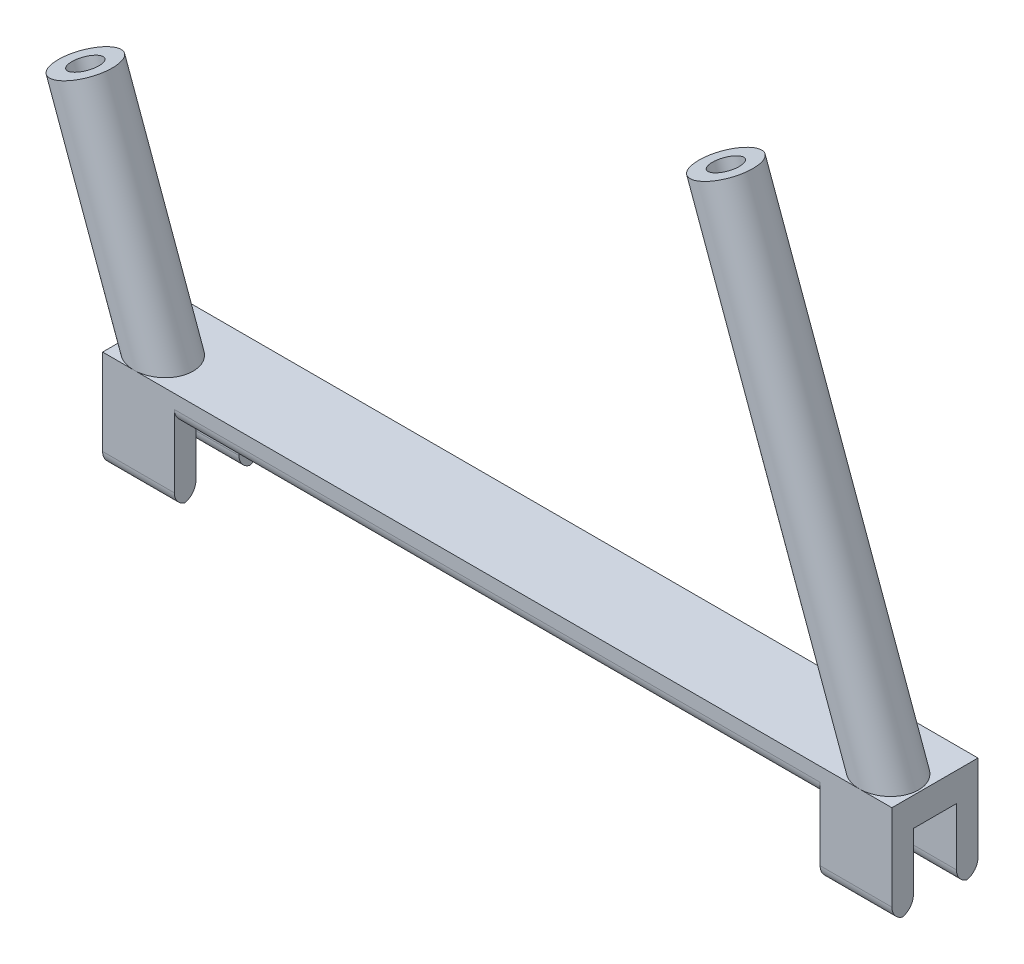
ISO-10303-21;
HEADER;
FILE_DESCRIPTION(('STEP AP214'),'2;1');
FILE_NAME('part.step','',(''),(''),'','','');
FILE_SCHEMA(('AUTOMOTIVE_DESIGN { 1 0 10303 214 1 1 1 1 }'));
ENDSEC;
DATA;
#1=APPLICATION_CONTEXT('core data for automotive mechanical design processes');
#2=APPLICATION_PROTOCOL_DEFINITION('international standard','automotive_design',2000,#1);
#3=PRODUCT_CONTEXT('',#1,'mechanical');
#4=PRODUCT('Part','Part','',(#3));
#5=PRODUCT_RELATED_PRODUCT_CATEGORY('part','',(#4));
#6=PRODUCT_DEFINITION_FORMATION('','',#4);
#7=PRODUCT_DEFINITION_CONTEXT('part definition',#1,'design');
#8=PRODUCT_DEFINITION('design','',#6,#7);
#9=PRODUCT_DEFINITION_SHAPE('','',#8);
#10=(LENGTH_UNIT() NAMED_UNIT(*) SI_UNIT(.MILLI.,.METRE.));
#11=(NAMED_UNIT(*) PLANE_ANGLE_UNIT() SI_UNIT($,.RADIAN.));
#12=(NAMED_UNIT(*) SI_UNIT($,.STERADIAN.) SOLID_ANGLE_UNIT());
#13=UNCERTAINTY_MEASURE_WITH_UNIT(LENGTH_MEASURE(1.E-05),#10,'distance_accuracy_value','');
#14=(GEOMETRIC_REPRESENTATION_CONTEXT(3) GLOBAL_UNCERTAINTY_ASSIGNED_CONTEXT((#13)) GLOBAL_UNIT_ASSIGNED_CONTEXT((#10,
#11,#12)) REPRESENTATION_CONTEXT('',''));
#15=CARTESIAN_POINT('',(0.,0.,0.));
#16=DIRECTION('',(0.,0.,1.));
#17=DIRECTION('',(1.,0.,0.));
#18=AXIS2_PLACEMENT_3D('',#15,#16,#17);
#19=CARTESIAN_POINT('',(110.,0.,3.));
#20=DIRECTION('',(0.,0.,-1.));
#21=DIRECTION('',(0.,1.,0.));
#22=AXIS2_PLACEMENT_3D('',#19,#20,#21);
#23=PLANE('',#22);
#24=DIRECTION('',(-1.,0.,0.));
#25=VECTOR('',#24,1.);
#26=CARTESIAN_POINT('',(110.,2.,3.));
#27=LINE('',#26,#25);
#28=CARTESIAN_POINT('',(0.,2.,3.));
#29=VERTEX_POINT('',#28);
#30=CARTESIAN_POINT('',(10.,2.,3.));
#31=VERTEX_POINT('',#30);
#32=EDGE_CURVE('E247',#29,#31,#27,.F.);
#33=ORIENTED_EDGE('',*,*,#32,.T.);
#34=DIRECTION('',(0.,1.,0.));
#35=VECTOR('',#34,1.);
#36=CARTESIAN_POINT('',(9.99999999999999,0.,3.));
#37=LINE('',#36,#35);
#38=CARTESIAN_POINT('',(9.99999999999999,10.,3.));
#39=VERTEX_POINT('',#38);
#40=EDGE_CURVE('E328',#31,#39,#37,.T.);
#41=ORIENTED_EDGE('',*,*,#40,.T.);
#42=DIRECTION('',(-1.,0.,0.));
#43=VECTOR('',#42,1.);
#44=CARTESIAN_POINT('',(110.,10.,3.));
#45=LINE('',#44,#43);
#46=CARTESIAN_POINT('',(0.,10.,3.));
#47=VERTEX_POINT('',#46);
#48=EDGE_CURVE('E362',#39,#47,#45,.T.);
#49=ORIENTED_EDGE('',*,*,#48,.T.);
#50=DIRECTION('',(0.,-1.,0.));
#51=VECTOR('',#50,1.);
#52=CARTESIAN_POINT('',(0.,0.,3.));
#53=LINE('',#52,#51);
#54=EDGE_CURVE('E258',#47,#29,#53,.T.);
#55=ORIENTED_EDGE('',*,*,#54,.T.);
#56=EDGE_LOOP('',(#33,#41,#49,#55));
#57=FACE_BOUND('',#56,.T.);
#58=ADVANCED_FACE('F35',(#57),#23,.F.);
#59=CARTESIAN_POINT('',(110.,10.,3.));
#60=DIRECTION('',(0.,1.,0.));
#61=DIRECTION('',(0.,0.,1.));
#62=AXIS2_PLACEMENT_3D('',#59,#60,#61);
#63=PLANE('',#62);
#64=ORIENTED_EDGE('',*,*,#48,.F.);
#65=DIRECTION('',(0.,0.,1.));
#66=VECTOR('',#65,1.);
#67=CARTESIAN_POINT('',(9.99999999999999,10.,3.));
#68=LINE('',#67,#66);
#69=CARTESIAN_POINT('',(9.99999999999999,10.,9.));
#70=VERTEX_POINT('',#69);
#71=EDGE_CURVE('E331',#39,#70,#68,.T.);
#72=ORIENTED_EDGE('',*,*,#71,.T.);
#73=DIRECTION('',(-1.,0.,0.));
#74=VECTOR('',#73,1.);
#75=CARTESIAN_POINT('',(110.,10.,9.));
#76=LINE('',#75,#74);
#77=CARTESIAN_POINT('',(0.,10.,9.));
#78=VERTEX_POINT('',#77);
#79=EDGE_CURVE('E350',#70,#78,#76,.T.);
#80=ORIENTED_EDGE('',*,*,#79,.T.);
#81=DIRECTION('',(0.,0.,-1.));
#82=VECTOR('',#81,1.);
#83=CARTESIAN_POINT('',(0.,10.,3.));
#84=LINE('',#83,#82);
#85=EDGE_CURVE('E345',#78,#47,#84,.T.);
#86=ORIENTED_EDGE('',*,*,#85,.T.);
#87=EDGE_LOOP('',(#64,#72,#80,#86));
#88=FACE_BOUND('',#87,.T.);
#89=ADVANCED_FACE('F390',(#88),#63,.F.);
#90=CARTESIAN_POINT('',(110.,0.,9.));
#91=DIRECTION('',(0.,0.,1.));
#92=DIRECTION('',(1.,0.,0.));
#93=AXIS2_PLACEMENT_3D('',#90,#91,#92);
#94=PLANE('',#93);
#95=ORIENTED_EDGE('',*,*,#79,.F.);
#96=DIRECTION('',(0.,-1.,0.));
#97=VECTOR('',#96,1.);
#98=CARTESIAN_POINT('',(9.99999999999999,0.,9.));
#99=LINE('',#98,#97);
#100=CARTESIAN_POINT('',(9.99999999999999,2.,9.));
#101=VERTEX_POINT('',#100);
#102=EDGE_CURVE('E334',#70,#101,#99,.T.);
#103=ORIENTED_EDGE('',*,*,#102,.T.);
#104=DIRECTION('',(-1.,0.,0.));
#105=VECTOR('',#104,1.);
#106=CARTESIAN_POINT('',(110.,2.,9.));
#107=LINE('',#106,#105);
#108=CARTESIAN_POINT('',(0.,2.,9.));
#109=VERTEX_POINT('',#108);
#110=EDGE_CURVE('E242',#101,#109,#107,.T.);
#111=ORIENTED_EDGE('',*,*,#110,.T.);
#112=DIRECTION('',(0.,1.,0.));
#113=VECTOR('',#112,1.);
#114=CARTESIAN_POINT('',(0.,0.,9.));
#115=LINE('',#114,#113);
#116=EDGE_CURVE('E353',#109,#78,#115,.T.);
#117=ORIENTED_EDGE('',*,*,#116,.T.);
#118=EDGE_LOOP('',(#95,#103,#111,#117));
#119=FACE_BOUND('',#118,.T.);
#120=ADVANCED_FACE('F403',(#119),#94,.F.);
#121=CARTESIAN_POINT('',(110.,2.,11.));
#122=DIRECTION('',(-1.,0.,0.));
#123=DIRECTION('',(0.,0.,1.));
#124=AXIS2_PLACEMENT_3D('',#121,#122,#123);
#125=CYLINDRICAL_SURFACE('',#124,2.);
#126=CARTESIAN_POINT('',(9.99999999999999,2.,11.));
#127=DIRECTION('',(-1.,0.,0.));
#128=DIRECTION('',(0.,-1.,0.));
#129=AXIS2_PLACEMENT_3D('',#126,#127,#128);
#130=CIRCLE('',#129,2.);
#131=CARTESIAN_POINT('',(10.,0.0635083268962918,10.5));
#132=VERTEX_POINT('',#131);
#133=EDGE_CURVE('E337',#132,#101,#130,.F.);
#134=ORIENTED_EDGE('',*,*,#133,.F.);
#135=DIRECTION('',(-1.,0.,0.));
#136=VECTOR('',#135,1.);
#137=CARTESIAN_POINT('',(55.,0.0635083268962918,10.5));
#138=LINE('',#137,#136);
#139=CARTESIAN_POINT('',(0.,0.0635083268962918,10.5));
#140=VERTEX_POINT('',#139);
#141=EDGE_CURVE('E255',#140,#132,#138,.F.);
#142=ORIENTED_EDGE('',*,*,#141,.F.);
#143=CARTESIAN_POINT('',(0.,2.,11.));
#144=DIRECTION('',(1.,0.,0.));
#145=DIRECTION('',(0.,0.,-1.));
#146=AXIS2_PLACEMENT_3D('',#143,#144,#145);
#147=CIRCLE('',#146,2.);
#148=EDGE_CURVE('E238',#109,#140,#147,.F.);
#149=ORIENTED_EDGE('',*,*,#148,.F.);
#150=ORIENTED_EDGE('',*,*,#110,.F.);
#151=EDGE_LOOP('',(#134,#142,#149,#150));
#152=FACE_BOUND('',#151,.T.);
#153=ADVANCED_FACE('F399',(#152),#125,.T.);
#154=CARTESIAN_POINT('',(0.,2.,10.));
#155=DIRECTION('',(1.,0.,0.));
#156=DIRECTION('',(0.,0.,-1.));
#157=AXIS2_PLACEMENT_3D('',#154,#155,#156);
#158=CYLINDRICAL_SURFACE('',#157,2.);
#159=CARTESIAN_POINT('',(10.,2.,10.));
#160=DIRECTION('',(-1.,0.,0.));
#161=DIRECTION('',(0.,-1.,0.));
#162=AXIS2_PLACEMENT_3D('',#159,#160,#161);
#163=CIRCLE('',#162,2.);
#164=CARTESIAN_POINT('',(10.,2.,12.));
#165=VERTEX_POINT('',#164);
#166=EDGE_CURVE('E339',#165,#132,#163,.F.);
#167=ORIENTED_EDGE('',*,*,#166,.F.);
#168=DIRECTION('',(1.,0.,0.));
#169=VECTOR('',#168,1.);
#170=CARTESIAN_POINT('',(0.,2.,12.));
#171=LINE('',#170,#169);
#172=CARTESIAN_POINT('',(0.,2.,12.));
#173=VERTEX_POINT('',#172);
#174=EDGE_CURVE('E222',#173,#165,#171,.T.);
#175=ORIENTED_EDGE('',*,*,#174,.F.);
#176=CARTESIAN_POINT('',(0.,2.,10.));
#177=DIRECTION('',(1.,0.,0.));
#178=DIRECTION('',(0.,0.,-1.));
#179=AXIS2_PLACEMENT_3D('',#176,#177,#178);
#180=CIRCLE('',#179,2.);
#181=EDGE_CURVE('E240',#140,#173,#180,.F.);
#182=ORIENTED_EDGE('',*,*,#181,.F.);
#183=ORIENTED_EDGE('',*,*,#141,.T.);
#184=EDGE_LOOP('',(#167,#175,#182,#183));
#185=FACE_BOUND('',#184,.T.);
#186=ADVANCED_FACE('F402',(#185),#158,.T.);
#187=CARTESIAN_POINT('',(0.,2.,2.));
#188=DIRECTION('',(-1.,0.,0.));
#189=DIRECTION('',(0.,0.,1.));
#190=AXIS2_PLACEMENT_3D('',#187,#188,#189);
#191=CYLINDRICAL_SURFACE('',#190,2.);
#192=CARTESIAN_POINT('',(10.,2.,2.));
#193=DIRECTION('',(-1.,0.,0.));
#194=DIRECTION('',(0.,-1.,0.));
#195=AXIS2_PLACEMENT_3D('',#192,#193,#194);
#196=CIRCLE('',#195,2.);
#197=CARTESIAN_POINT('',(10.,0.0635083268962918,1.5));
#198=VERTEX_POINT('',#197);
#199=CARTESIAN_POINT('',(10.,2.,0.));
#200=VERTEX_POINT('',#199);
#201=EDGE_CURVE('E326',#198,#200,#196,.F.);
#202=ORIENTED_EDGE('',*,*,#201,.F.);
#203=DIRECTION('',(-1.,0.,0.));
#204=VECTOR('',#203,1.);
#205=CARTESIAN_POINT('',(55.,0.0635083268962918,1.5));
#206=LINE('',#205,#204);
#207=CARTESIAN_POINT('',(0.,0.0635083268962918,1.5));
#208=VERTEX_POINT('',#207);
#209=EDGE_CURVE('E260',#208,#198,#206,.F.);
#210=ORIENTED_EDGE('',*,*,#209,.F.);
#211=CARTESIAN_POINT('',(0.,2.,2.));
#212=DIRECTION('',(1.,0.,0.));
#213=DIRECTION('',(0.,0.,-1.));
#214=AXIS2_PLACEMENT_3D('',#211,#212,#213);
#215=CIRCLE('',#214,2.);
#216=CARTESIAN_POINT('',(0.,2.,0.));
#217=VERTEX_POINT('',#216);
#218=EDGE_CURVE('E234',#217,#208,#215,.F.);
#219=ORIENTED_EDGE('',*,*,#218,.F.);
#220=DIRECTION('',(1.,0.,0.));
#221=VECTOR('',#220,1.);
#222=CARTESIAN_POINT('',(0.,2.,0.));
#223=LINE('',#222,#221);
#224=EDGE_CURVE('E250',#200,#217,#223,.F.);
#225=ORIENTED_EDGE('',*,*,#224,.F.);
#226=EDGE_LOOP('',(#202,#210,#219,#225));
#227=FACE_BOUND('',#226,.T.);
#228=ADVANCED_FACE('F379',(#227),#191,.T.);
#229=CARTESIAN_POINT('',(0.,2.,0.999999999999999));
#230=DIRECTION('',(-1.,0.,0.));
#231=DIRECTION('',(0.,0.,1.));
#232=AXIS2_PLACEMENT_3D('',#229,#230,#231);
#233=CYLINDRICAL_SURFACE('',#232,2.);
#234=CARTESIAN_POINT('',(10.,2.,0.999999999999999));
#235=DIRECTION('',(-1.,0.,0.));
#236=DIRECTION('',(0.,-1.,0.));
#237=AXIS2_PLACEMENT_3D('',#234,#235,#236);
#238=CIRCLE('',#237,2.);
#239=EDGE_CURVE('E265',#31,#198,#238,.F.);
#240=ORIENTED_EDGE('',*,*,#239,.F.);
#241=ORIENTED_EDGE('',*,*,#32,.F.);
#242=CARTESIAN_POINT('',(0.,2.,0.999999999999999));
#243=DIRECTION('',(1.,0.,0.));
#244=DIRECTION('',(0.,0.,-1.));
#245=AXIS2_PLACEMENT_3D('',#242,#243,#244);
#246=CIRCLE('',#245,2.);
#247=EDGE_CURVE('E236',#208,#29,#246,.F.);
#248=ORIENTED_EDGE('',*,*,#247,.F.);
#249=ORIENTED_EDGE('',*,*,#209,.T.);
#250=EDGE_LOOP('',(#240,#241,#248,#249));
#251=FACE_BOUND('',#250,.T.);
#252=ADVANCED_FACE('F384',(#251),#233,.T.);
#253=CARTESIAN_POINT('',(0.,0.,12.));
#254=DIRECTION('',(1.,0.,0.));
#255=DIRECTION('',(0.,0.,-1.));
#256=AXIS2_PLACEMENT_3D('',#253,#254,#255);
#257=PLANE('',#256);
#258=ORIENTED_EDGE('',*,*,#148,.T.);
#259=ORIENTED_EDGE('',*,*,#181,.T.);
#260=DIRECTION('',(0.,-1.,0.));
#261=VECTOR('',#260,1.);
#262=CARTESIAN_POINT('',(0.,0.,12.));
#263=LINE('',#262,#261);
#264=CARTESIAN_POINT('',(0.,14.,12.));
#265=VERTEX_POINT('',#264);
#266=EDGE_CURVE('E207',#265,#173,#263,.T.);
#267=ORIENTED_EDGE('',*,*,#266,.F.);
#268=DIRECTION('',(0.,0.,-1.));
#269=VECTOR('',#268,1.);
#270=CARTESIAN_POINT('',(0.,14.,12.));
#271=LINE('',#270,#269);
#272=CARTESIAN_POINT('',(0.,14.,0.));
#273=VERTEX_POINT('',#272);
#274=EDGE_CURVE('E204',#265,#273,#271,.T.);
#275=ORIENTED_EDGE('',*,*,#274,.T.);
#276=DIRECTION('',(0.,-1.,0.));
#277=VECTOR('',#276,1.);
#278=CARTESIAN_POINT('',(0.,0.,0.));
#279=LINE('',#278,#277);
#280=EDGE_CURVE('E361',#273,#217,#279,.T.);
#281=ORIENTED_EDGE('',*,*,#280,.T.);
#282=ORIENTED_EDGE('',*,*,#218,.T.);
#283=ORIENTED_EDGE('',*,*,#247,.T.);
#284=ORIENTED_EDGE('',*,*,#54,.F.);
#285=ORIENTED_EDGE('',*,*,#85,.F.);
#286=ORIENTED_EDGE('',*,*,#116,.F.);
#287=EDGE_LOOP('',(#258,#259,#267,#275,#281,#282,#283,#284,#285,#286));
#288=FACE_BOUND('',#287,.T.);
#289=ADVANCED_FACE('F373',(#288),#257,.F.);
#290=CARTESIAN_POINT('',(110.,0.,12.));
#291=DIRECTION('',(-1.,0.,0.));
#292=DIRECTION('',(0.,0.,1.));
#293=AXIS2_PLACEMENT_3D('',#290,#291,#292);
#294=PLANE('',#293);
#295=DIRECTION('',(0.,1.,0.));
#296=VECTOR('',#295,1.);
#297=CARTESIAN_POINT('',(110.,0.,12.));
#298=LINE('',#297,#296);
#299=CARTESIAN_POINT('',(110.,2.,12.));
#300=VERTEX_POINT('',#299);
#301=CARTESIAN_POINT('',(110.,14.,12.));
#302=VERTEX_POINT('',#301);
#303=EDGE_CURVE('E206',#300,#302,#298,.T.);
#304=ORIENTED_EDGE('',*,*,#303,.F.);
#305=CARTESIAN_POINT('',(110.,2.,10.));
#306=DIRECTION('',(-1.,0.,0.));
#307=DIRECTION('',(0.,0.,1.));
#308=AXIS2_PLACEMENT_3D('',#305,#306,#307);
#309=CIRCLE('',#308,2.);
#310=CARTESIAN_POINT('',(110.,0.0635083268962918,10.5));
#311=VERTEX_POINT('',#310);
#312=EDGE_CURVE('E231',#300,#311,#309,.F.);
#313=ORIENTED_EDGE('',*,*,#312,.T.);
#314=CARTESIAN_POINT('',(110.,2.,11.));
#315=DIRECTION('',(-1.,0.,0.));
#316=DIRECTION('',(0.,0.,1.));
#317=AXIS2_PLACEMENT_3D('',#314,#315,#316);
#318=CIRCLE('',#317,2.);
#319=CARTESIAN_POINT('',(110.,2.,9.));
#320=VERTEX_POINT('',#319);
#321=EDGE_CURVE('E229',#311,#320,#318,.F.);
#322=ORIENTED_EDGE('',*,*,#321,.T.);
#323=DIRECTION('',(0.,1.,0.));
#324=VECTOR('',#323,1.);
#325=CARTESIAN_POINT('',(110.,0.,9.));
#326=LINE('',#325,#324);
#327=CARTESIAN_POINT('',(110.,10.,9.));
#328=VERTEX_POINT('',#327);
#329=EDGE_CURVE('E344',#320,#328,#326,.T.);
#330=ORIENTED_EDGE('',*,*,#329,.T.);
#331=DIRECTION('',(0.,0.,-1.));
#332=VECTOR('',#331,1.);
#333=CARTESIAN_POINT('',(110.,10.,3.));
#334=LINE('',#333,#332);
#335=CARTESIAN_POINT('',(110.,10.,3.));
#336=VERTEX_POINT('',#335);
#337=EDGE_CURVE('E347',#328,#336,#334,.T.);
#338=ORIENTED_EDGE('',*,*,#337,.T.);
#339=DIRECTION('',(0.,-1.,0.));
#340=VECTOR('',#339,1.);
#341=CARTESIAN_POINT('',(110.,0.,3.));
#342=LINE('',#341,#340);
#343=CARTESIAN_POINT('',(110.,2.,3.));
#344=VERTEX_POINT('',#343);
#345=EDGE_CURVE('E341',#336,#344,#342,.T.);
#346=ORIENTED_EDGE('',*,*,#345,.T.);
#347=CARTESIAN_POINT('',(110.,2.,0.999999999999999));
#348=DIRECTION('',(-1.,0.,0.));
#349=DIRECTION('',(0.,0.,1.));
#350=AXIS2_PLACEMENT_3D('',#347,#348,#349);
#351=CIRCLE('',#350,2.);
#352=CARTESIAN_POINT('',(110.,0.0635083268962918,1.5));
#353=VERTEX_POINT('',#352);
#354=EDGE_CURVE('E226',#344,#353,#351,.F.);
#355=ORIENTED_EDGE('',*,*,#354,.T.);
#356=CARTESIAN_POINT('',(110.,2.,2.));
#357=DIRECTION('',(-1.,0.,0.));
#358=DIRECTION('',(0.,0.,1.));
#359=AXIS2_PLACEMENT_3D('',#356,#357,#358);
#360=CIRCLE('',#359,2.);
#361=CARTESIAN_POINT('',(110.,2.,0.));
#362=VERTEX_POINT('',#361);
#363=EDGE_CURVE('E224',#353,#362,#360,.F.);
#364=ORIENTED_EDGE('',*,*,#363,.T.);
#365=DIRECTION('',(0.,1.,0.));
#366=VECTOR('',#365,1.);
#367=CARTESIAN_POINT('',(110.,0.,0.));
#368=LINE('',#367,#366);
#369=CARTESIAN_POINT('',(110.,14.,0.));
#370=VERTEX_POINT('',#369);
#371=EDGE_CURVE('E367',#362,#370,#368,.T.);
#372=ORIENTED_EDGE('',*,*,#371,.T.);
#373=DIRECTION('',(0.,0.,-1.));
#374=VECTOR('',#373,1.);
#375=CARTESIAN_POINT('',(110.,14.,12.));
#376=LINE('',#375,#374);
#377=EDGE_CURVE('E210',#302,#370,#376,.T.);
#378=ORIENTED_EDGE('',*,*,#377,.F.);
#379=EDGE_LOOP('',(#304,#313,#322,#330,#338,#346,#355,#364,#372,#378));
#380=FACE_BOUND('',#379,.T.);
#381=ADVANCED_FACE('F532',(#380),#294,.F.);
#382=CARTESIAN_POINT('',(0.,14.,12.));
#383=DIRECTION('',(0.,-1.,0.));
#384=DIRECTION('',(0.,0.,-1.));
#385=AXIS2_PLACEMENT_3D('',#382,#383,#384);
#386=PLANE('',#385);
#387=DIRECTION('',(-1.,0.,0.));
#388=VECTOR('',#387,1.);
#389=CARTESIAN_POINT('',(0.,14.,12.));
#390=LINE('',#389,#388);
#391=CARTESIAN_POINT('',(105.460017252362,14.,12.));
#392=VERTEX_POINT('',#391);
#393=CARTESIAN_POINT('',(4.36312886715122,14.,12.));
#394=VERTEX_POINT('',#393);
#395=EDGE_CURVE('E189',#392,#394,#390,.T.);
#396=ORIENTED_EDGE('',*,*,#395,.F.);
#397=CARTESIAN_POINT('',(105.460017252362,14.,7.99999999999766));
#398=DIRECTION('',(0.,-1.,0.));
#399=DIRECTION('',(-1.,0.,0.));
#400=AXIS2_PLACEMENT_3D('',#397,#398,#399);
#401=ELLIPSE('',#400,4.25671108990363,4.);
#402=EDGE_CURVE('E48',#392,#392,#401,.F.);
#403=ORIENTED_EDGE('',*,*,#402,.F.);
#404=EDGE_CURVE('E196',#302,#392,#390,.T.);
#405=ORIENTED_EDGE('',*,*,#404,.F.);
#406=ORIENTED_EDGE('',*,*,#377,.T.);
#407=DIRECTION('',(-1.,0.,0.));
#408=VECTOR('',#407,1.);
#409=CARTESIAN_POINT('',(0.,14.,0.));
#410=LINE('',#409,#408);
#411=EDGE_CURVE('E219',#370,#273,#410,.T.);
#412=ORIENTED_EDGE('',*,*,#411,.T.);
#413=ORIENTED_EDGE('',*,*,#274,.F.);
#414=EDGE_CURVE('E193',#394,#265,#390,.T.);
#415=ORIENTED_EDGE('',*,*,#414,.F.);
#416=CARTESIAN_POINT('',(4.36312886715122,14.,8.));
#417=DIRECTION('',(0.,-1.,0.));
#418=DIRECTION('',(-1.,0.,0.));
#419=AXIS2_PLACEMENT_3D('',#416,#417,#418);
#420=ELLIPSE('',#419,4.25671108990363,4.);
#421=EDGE_CURVE('E202',#394,#394,#420,.F.);
#422=ORIENTED_EDGE('',*,*,#421,.F.);
#423=EDGE_LOOP('',(#396,#403,#405,#406,#412,#413,#415,#422));
#424=FACE_BOUND('',#423,.T.);
#425=ADVANCED_FACE('F200',(#424),#386,.F.);
#426=CARTESIAN_POINT('',(0.,0.,12.));
#427=DIRECTION('',(0.,0.,-1.));
#428=DIRECTION('',(-1.,0.,0.));
#429=AXIS2_PLACEMENT_3D('',#426,#427,#428);
#430=PLANE('',#429);
#431=DIRECTION('',(0.,-1.,0.));
#432=VECTOR('',#431,1.);
#433=CARTESIAN_POINT('',(10.,0.0635083268962918,12.));
#434=LINE('',#433,#432);
#435=CARTESIAN_POINT('',(10.,12.0635083268963,12.));
#436=VERTEX_POINT('',#435);
#437=EDGE_CURVE('E55',#436,#165,#434,.T.);
#438=ORIENTED_EDGE('',*,*,#437,.F.);
#439=DIRECTION('',(-1.,0.,0.));
#440=VECTOR('',#439,1.);
#441=CARTESIAN_POINT('',(0.,12.0635083268963,12.));
#442=LINE('',#441,#440);
#443=CARTESIAN_POINT('',(100.,12.0635083268963,12.));
#444=VERTEX_POINT('',#443);
#445=EDGE_CURVE('E275',#436,#444,#442,.F.);
#446=ORIENTED_EDGE('',*,*,#445,.T.);
#447=DIRECTION('',(0.,1.,0.));
#448=VECTOR('',#447,1.);
#449=CARTESIAN_POINT('',(100.,0.0635083268962918,12.));
#450=LINE('',#449,#448);
#451=CARTESIAN_POINT('',(100.,2.,12.));
#452=VERTEX_POINT('',#451);
#453=EDGE_CURVE('E291',#452,#444,#450,.T.);
#454=ORIENTED_EDGE('',*,*,#453,.F.);
#455=EDGE_CURVE('E216',#452,#300,#171,.T.);
#456=ORIENTED_EDGE('',*,*,#455,.T.);
#457=ORIENTED_EDGE('',*,*,#303,.T.);
#458=ORIENTED_EDGE('',*,*,#404,.T.);
#459=ORIENTED_EDGE('',*,*,#395,.T.);
#460=ORIENTED_EDGE('',*,*,#414,.T.);
#461=ORIENTED_EDGE('',*,*,#266,.T.);
#462=ORIENTED_EDGE('',*,*,#174,.T.);
#463=EDGE_LOOP('',(#438,#446,#454,#456,#457,#458,#459,#460,#461,#462));
#464=FACE_BOUND('',#463,.T.);
#465=ADVANCED_FACE('F191',(#464),#430,.F.);
#466=CARTESIAN_POINT('',(0.,0.,0.));
#467=DIRECTION('',(0.,0.,-1.));
#468=DIRECTION('',(-1.,0.,0.));
#469=AXIS2_PLACEMENT_3D('',#466,#467,#468);
#470=PLANE('',#469);
#471=DIRECTION('',(-1.,0.,0.));
#472=VECTOR('',#471,1.);
#473=CARTESIAN_POINT('',(10.,12.0635083268963,0.));
#474=LINE('',#473,#472);
#475=CARTESIAN_POINT('',(100.,12.0635083268963,0.));
#476=VERTEX_POINT('',#475);
#477=CARTESIAN_POINT('',(10.,12.0635083268963,0.));
#478=VERTEX_POINT('',#477);
#479=EDGE_CURVE('E267',#476,#478,#474,.T.);
#480=ORIENTED_EDGE('',*,*,#479,.T.);
#481=DIRECTION('',(0.,-1.,0.));
#482=VECTOR('',#481,1.);
#483=CARTESIAN_POINT('',(10.,0.0635083268962918,0.));
#484=LINE('',#483,#482);
#485=EDGE_CURVE('E448',#478,#200,#484,.T.);
#486=ORIENTED_EDGE('',*,*,#485,.T.);
#487=ORIENTED_EDGE('',*,*,#224,.T.);
#488=ORIENTED_EDGE('',*,*,#280,.F.);
#489=ORIENTED_EDGE('',*,*,#411,.F.);
#490=ORIENTED_EDGE('',*,*,#371,.F.);
#491=CARTESIAN_POINT('',(100.,2.,0.));
#492=VERTEX_POINT('',#491);
#493=EDGE_CURVE('E251',#362,#492,#223,.F.);
#494=ORIENTED_EDGE('',*,*,#493,.T.);
#495=DIRECTION('',(0.,1.,0.));
#496=VECTOR('',#495,1.);
#497=CARTESIAN_POINT('',(100.,0.0635083268962918,0.));
#498=LINE('',#497,#496);
#499=EDGE_CURVE('E301',#492,#476,#498,.T.);
#500=ORIENTED_EDGE('',*,*,#499,.T.);
#501=EDGE_LOOP('',(#480,#486,#487,#488,#489,#490,#494,#500));
#502=FACE_BOUND('',#501,.T.);
#503=ADVANCED_FACE('F424',(#502),#470,.T.);
#504=CARTESIAN_POINT('',(100.,10.,3.));
#505=VERTEX_POINT('',#504);
#506=EDGE_CURVE('E358',#336,#505,#45,.T.);
#507=ORIENTED_EDGE('',*,*,#506,.T.);
#508=DIRECTION('',(0.,-1.,0.));
#509=VECTOR('',#508,1.);
#510=CARTESIAN_POINT('',(100.,0.,3.));
#511=LINE('',#510,#509);
#512=CARTESIAN_POINT('',(100.,2.,3.));
#513=VERTEX_POINT('',#512);
#514=EDGE_CURVE('E309',#505,#513,#511,.T.);
#515=ORIENTED_EDGE('',*,*,#514,.T.);
#516=EDGE_CURVE('E246',#513,#344,#27,.F.);
#517=ORIENTED_EDGE('',*,*,#516,.T.);
#518=ORIENTED_EDGE('',*,*,#345,.F.);
#519=EDGE_LOOP('',(#507,#515,#517,#518));
#520=FACE_BOUND('',#519,.T.);
#521=ADVANCED_FACE('F419',(#520),#23,.F.);
#522=CARTESIAN_POINT('',(100.,10.,9.));
#523=VERTEX_POINT('',#522);
#524=EDGE_CURVE('E363',#328,#523,#76,.T.);
#525=ORIENTED_EDGE('',*,*,#524,.T.);
#526=DIRECTION('',(0.,0.,-1.));
#527=VECTOR('',#526,1.);
#528=CARTESIAN_POINT('',(100.,10.,3.));
#529=LINE('',#528,#527);
#530=EDGE_CURVE('E316',#523,#505,#529,.T.);
#531=ORIENTED_EDGE('',*,*,#530,.T.);
#532=ORIENTED_EDGE('',*,*,#506,.F.);
#533=ORIENTED_EDGE('',*,*,#337,.F.);
#534=EDGE_LOOP('',(#525,#531,#532,#533));
#535=FACE_BOUND('',#534,.T.);
#536=ADVANCED_FACE('F414',(#535),#63,.F.);
#537=CARTESIAN_POINT('',(100.,2.,9.));
#538=VERTEX_POINT('',#537);
#539=EDGE_CURVE('E243',#320,#538,#107,.T.);
#540=ORIENTED_EDGE('',*,*,#539,.T.);
#541=DIRECTION('',(0.,1.,0.));
#542=VECTOR('',#541,1.);
#543=CARTESIAN_POINT('',(100.,0.,9.));
#544=LINE('',#543,#542);
#545=EDGE_CURVE('E319',#538,#523,#544,.T.);
#546=ORIENTED_EDGE('',*,*,#545,.T.);
#547=ORIENTED_EDGE('',*,*,#524,.F.);
#548=ORIENTED_EDGE('',*,*,#329,.F.);
#549=EDGE_LOOP('',(#540,#546,#547,#548));
#550=FACE_BOUND('',#549,.T.);
#551=ADVANCED_FACE('F406',(#550),#94,.F.);
#552=CARTESIAN_POINT('',(100.,2.,11.));
#553=DIRECTION('',(1.,0.,0.));
#554=DIRECTION('',(0.,0.,-1.));
#555=AXIS2_PLACEMENT_3D('',#552,#553,#554);
#556=CIRCLE('',#555,2.);
#557=CARTESIAN_POINT('',(100.,0.0635083268962918,10.5));
#558=VERTEX_POINT('',#557);
#559=EDGE_CURVE('E322',#538,#558,#556,.F.);
#560=ORIENTED_EDGE('',*,*,#559,.F.);
#561=ORIENTED_EDGE('',*,*,#539,.F.);
#562=ORIENTED_EDGE('',*,*,#321,.F.);
#563=EDGE_CURVE('E259',#558,#311,#138,.F.);
#564=ORIENTED_EDGE('',*,*,#563,.F.);
#565=EDGE_LOOP('',(#560,#561,#562,#564));
#566=FACE_BOUND('',#565,.T.);
#567=ADVANCED_FACE('F412',(#566),#125,.T.);
#568=CARTESIAN_POINT('',(100.,2.,10.));
#569=DIRECTION('',(1.,0.,0.));
#570=DIRECTION('',(0.,0.,-1.));
#571=AXIS2_PLACEMENT_3D('',#568,#569,#570);
#572=CIRCLE('',#571,2.);
#573=EDGE_CURVE('E324',#558,#452,#572,.F.);
#574=ORIENTED_EDGE('',*,*,#573,.F.);
#575=ORIENTED_EDGE('',*,*,#563,.T.);
#576=ORIENTED_EDGE('',*,*,#312,.F.);
#577=ORIENTED_EDGE('',*,*,#455,.F.);
#578=EDGE_LOOP('',(#574,#575,#576,#577));
#579=FACE_BOUND('',#578,.T.);
#580=ADVANCED_FACE('F445',(#579),#158,.T.);
#581=CARTESIAN_POINT('',(100.,2.,2.));
#582=DIRECTION('',(1.,0.,0.));
#583=DIRECTION('',(0.,0.,-1.));
#584=AXIS2_PLACEMENT_3D('',#581,#582,#583);
#585=CIRCLE('',#584,2.);
#586=CARTESIAN_POINT('',(100.,0.0635083268962918,1.5));
#587=VERTEX_POINT('',#586);
#588=EDGE_CURVE('E307',#492,#587,#585,.F.);
#589=ORIENTED_EDGE('',*,*,#588,.F.);
#590=ORIENTED_EDGE('',*,*,#493,.F.);
#591=ORIENTED_EDGE('',*,*,#363,.F.);
#592=EDGE_CURVE('E263',#587,#353,#206,.F.);
#593=ORIENTED_EDGE('',*,*,#592,.F.);
#594=EDGE_LOOP('',(#589,#590,#591,#593));
#595=FACE_BOUND('',#594,.T.);
#596=ADVANCED_FACE('F518',(#595),#191,.T.);
#597=CARTESIAN_POINT('',(100.,2.,0.999999999999999));
#598=DIRECTION('',(1.,0.,0.));
#599=DIRECTION('',(0.,0.,-1.));
#600=AXIS2_PLACEMENT_3D('',#597,#598,#599);
#601=CIRCLE('',#600,2.);
#602=EDGE_CURVE('E254',#587,#513,#601,.F.);
#603=ORIENTED_EDGE('',*,*,#602,.F.);
#604=ORIENTED_EDGE('',*,*,#592,.T.);
#605=ORIENTED_EDGE('',*,*,#354,.F.);
#606=ORIENTED_EDGE('',*,*,#516,.F.);
#607=EDGE_LOOP('',(#603,#604,#605,#606));
#608=FACE_BOUND('',#607,.T.);
#609=ADVANCED_FACE('F514',(#608),#233,.T.);
#610=CARTESIAN_POINT('',(10.,0.0635083268962918,0.));
#611=DIRECTION('',(-1.,0.,0.));
#612=DIRECTION('',(0.,-1.,0.));
#613=AXIS2_PLACEMENT_3D('',#610,#611,#612);
#614=PLANE('',#613);
#615=ORIENTED_EDGE('',*,*,#166,.T.);
#616=ORIENTED_EDGE('',*,*,#133,.T.);
#617=ORIENTED_EDGE('',*,*,#102,.F.);
#618=ORIENTED_EDGE('',*,*,#71,.F.);
#619=ORIENTED_EDGE('',*,*,#40,.F.);
#620=ORIENTED_EDGE('',*,*,#239,.T.);
#621=ORIENTED_EDGE('',*,*,#201,.T.);
#622=ORIENTED_EDGE('',*,*,#485,.F.);
#623=CARTESIAN_POINT('',(10.,12.0635083268963,2.));
#624=DIRECTION('',(-1.,0.,0.));
#625=DIRECTION('',(0.,-1.,0.));
#626=AXIS2_PLACEMENT_3D('',#623,#624,#625);
#627=CIRCLE('',#626,2.);
#628=CARTESIAN_POINT('',(10.,10.0635083268963,2.));
#629=VERTEX_POINT('',#628);
#630=EDGE_CURVE('E277',#478,#629,#627,.T.);
#631=ORIENTED_EDGE('',*,*,#630,.T.);
#632=DIRECTION('',(0.,0.,1.));
#633=VECTOR('',#632,1.);
#634=CARTESIAN_POINT('',(10.,10.0635083268963,0.));
#635=LINE('',#634,#633);
#636=CARTESIAN_POINT('',(10.,10.0635083268963,10.));
#637=VERTEX_POINT('',#636);
#638=EDGE_CURVE('E300',#629,#637,#635,.T.);
#639=ORIENTED_EDGE('',*,*,#638,.T.);
#640=CARTESIAN_POINT('',(10.,12.0635083268963,10.));
#641=DIRECTION('',(-1.,0.,0.));
#642=DIRECTION('',(0.,-1.,0.));
#643=AXIS2_PLACEMENT_3D('',#640,#641,#642);
#644=CIRCLE('',#643,2.);
#645=EDGE_CURVE('E282',#637,#436,#644,.T.);
#646=ORIENTED_EDGE('',*,*,#645,.T.);
#647=ORIENTED_EDGE('',*,*,#437,.T.);
#648=EDGE_LOOP('',(#615,#616,#617,#618,#619,#620,#621,#622,#631,#639,#646,#647));
#649=FACE_BOUND('',#648,.T.);
#650=ADVANCED_FACE('F304',(#649),#614,.F.);
#651=CARTESIAN_POINT('',(10.,10.0635083268963,0.));
#652=DIRECTION('',(0.,1.,0.));
#653=DIRECTION('',(0.,0.,1.));
#654=AXIS2_PLACEMENT_3D('',#651,#652,#653);
#655=PLANE('',#654);
#656=ORIENTED_EDGE('',*,*,#638,.F.);
#657=DIRECTION('',(-1.,0.,0.));
#658=VECTOR('',#657,1.);
#659=CARTESIAN_POINT('',(100.,10.0635083268963,2.));
#660=LINE('',#659,#658);
#661=CARTESIAN_POINT('',(100.,10.0635083268963,2.));
#662=VERTEX_POINT('',#661);
#663=EDGE_CURVE('E273',#629,#662,#660,.F.);
#664=ORIENTED_EDGE('',*,*,#663,.T.);
#665=DIRECTION('',(0.,0.,1.));
#666=VECTOR('',#665,1.);
#667=CARTESIAN_POINT('',(100.,10.0635083268963,0.));
#668=LINE('',#667,#666);
#669=CARTESIAN_POINT('',(100.,10.0635083268963,10.));
#670=VERTEX_POINT('',#669);
#671=EDGE_CURVE('E288',#662,#670,#668,.T.);
#672=ORIENTED_EDGE('',*,*,#671,.T.);
#673=DIRECTION('',(-1.,0.,0.));
#674=VECTOR('',#673,1.);
#675=CARTESIAN_POINT('',(10.,10.0635083268963,10.));
#676=LINE('',#675,#674);
#677=EDGE_CURVE('E270',#670,#637,#676,.T.);
#678=ORIENTED_EDGE('',*,*,#677,.T.);
#679=EDGE_LOOP('',(#656,#664,#672,#678));
#680=FACE_BOUND('',#679,.T.);
#681=ADVANCED_FACE('F297',(#680),#655,.F.);
#682=CARTESIAN_POINT('',(100.,0.0635083268962918,0.));
#683=DIRECTION('',(1.,0.,0.));
#684=DIRECTION('',(0.,0.,-1.));
#685=AXIS2_PLACEMENT_3D('',#682,#683,#684);
#686=PLANE('',#685);
#687=ORIENTED_EDGE('',*,*,#573,.T.);
#688=ORIENTED_EDGE('',*,*,#453,.T.);
#689=CARTESIAN_POINT('',(100.,12.0635083268963,10.));
#690=DIRECTION('',(1.,0.,0.));
#691=DIRECTION('',(0.,0.,-1.));
#692=AXIS2_PLACEMENT_3D('',#689,#690,#691);
#693=CIRCLE('',#692,2.);
#694=EDGE_CURVE('E43',#444,#670,#693,.T.);
#695=ORIENTED_EDGE('',*,*,#694,.T.);
#696=ORIENTED_EDGE('',*,*,#671,.F.);
#697=CARTESIAN_POINT('',(100.,12.0635083268963,2.));
#698=DIRECTION('',(1.,0.,0.));
#699=DIRECTION('',(0.,0.,-1.));
#700=AXIS2_PLACEMENT_3D('',#697,#698,#699);
#701=CIRCLE('',#700,2.);
#702=EDGE_CURVE('E279',#662,#476,#701,.T.);
#703=ORIENTED_EDGE('',*,*,#702,.T.);
#704=ORIENTED_EDGE('',*,*,#499,.F.);
#705=ORIENTED_EDGE('',*,*,#588,.T.);
#706=ORIENTED_EDGE('',*,*,#602,.T.);
#707=ORIENTED_EDGE('',*,*,#514,.F.);
#708=ORIENTED_EDGE('',*,*,#530,.F.);
#709=ORIENTED_EDGE('',*,*,#545,.F.);
#710=ORIENTED_EDGE('',*,*,#559,.T.);
#711=EDGE_LOOP('',(#687,#688,#695,#696,#703,#704,#705,#706,#707,#708,#709,#710));
#712=FACE_BOUND('',#711,.T.);
#713=ADVANCED_FACE('F287',(#712),#686,.F.);
#714=CARTESIAN_POINT('',(0.,12.0635083268963,2.));
#715=DIRECTION('',(1.,0.,0.));
#716=DIRECTION('',(0.,0.,-1.));
#717=AXIS2_PLACEMENT_3D('',#714,#715,#716);
#718=CYLINDRICAL_SURFACE('',#717,2.);
#719=ORIENTED_EDGE('',*,*,#702,.F.);
#720=ORIENTED_EDGE('',*,*,#663,.F.);
#721=ORIENTED_EDGE('',*,*,#630,.F.);
#722=ORIENTED_EDGE('',*,*,#479,.F.);
#723=EDGE_LOOP('',(#719,#720,#721,#722));
#724=FACE_BOUND('',#723,.T.);
#725=ADVANCED_FACE('F512',(#724),#718,.T.);
#726=CARTESIAN_POINT('',(10.,12.0635083268963,10.));
#727=DIRECTION('',(-1.,0.,0.));
#728=DIRECTION('',(0.,0.,1.));
#729=AXIS2_PLACEMENT_3D('',#726,#727,#728);
#730=CYLINDRICAL_SURFACE('',#729,2.);
#731=ORIENTED_EDGE('',*,*,#694,.F.);
#732=ORIENTED_EDGE('',*,*,#445,.F.);
#733=ORIENTED_EDGE('',*,*,#645,.F.);
#734=ORIENTED_EDGE('',*,*,#677,.F.);
#735=EDGE_LOOP('',(#731,#732,#733,#734));
#736=FACE_BOUND('',#735,.T.);
#737=ADVANCED_FACE('F37',(#736),#730,.T.);
#738=CARTESIAN_POINT('',(21.2000814989494,-32.2591471682945,8.));
#739=DIRECTION('',(-0.342020143325657,0.939692620785913,0.));
#740=DIRECTION('',(-0.939692620785913,-0.342020143325657,0.));
#741=AXIS2_PLACEMENT_3D('',#738,#739,#740);
#742=CYLINDRICAL_SURFACE('',#741,4.);
#743=ORIENTED_EDGE('',*,*,#421,.T.);
#744=EDGE_LOOP('',(#743));
#745=FACE_BOUND('',#744,.T.);
#746=CARTESIAN_POINT('',(-6.40786455454747,43.5930612112126,8.));
#747=DIRECTION('',(-0.342020143325657,0.939692620785913,0.));
#748=DIRECTION('',(-0.939692620785913,-0.342020143325657,0.));
#749=AXIS2_PLACEMENT_3D('',#746,#747,#748);
#750=CIRCLE('',#749,4.);
#751=CARTESIAN_POINT('',(-10.1666350376911,42.22498063791,8.));
#752=VERTEX_POINT('',#751);
#753=EDGE_CURVE('E456',#752,#752,#750,.T.);
#754=ORIENTED_EDGE('',*,*,#753,.F.);
#755=EDGE_LOOP('',(#754));
#756=FACE_BOUND('',#755,.T.);
#757=ADVANCED_FACE('F501',(#745,#756),#742,.T.);
#758=CARTESIAN_POINT('',(21.2000814989494,-32.2591471682945,8.));
#759=DIRECTION('',(-0.342020143325657,0.939692620785913,0.));
#760=DIRECTION('',(-0.939692620785913,-0.342020143325657,0.));
#761=AXIS2_PLACEMENT_3D('',#758,#759,#760);
#762=CYLINDRICAL_SURFACE('',#761,2.);
#763=CARTESIAN_POINT('',(4.36312886715122,14.,8.));
#764=DIRECTION('',(0.,-1.,0.));
#765=DIRECTION('',(-1.,0.,0.));
#766=AXIS2_PLACEMENT_3D('',#763,#764,#765);
#767=ELLIPSE('',#766,2.12835554495182,2.);
#768=CARTESIAN_POINT('',(2.2347733221994,14.,8.));
#769=VERTEX_POINT('',#768);
#770=EDGE_CURVE('E451',#769,#769,#767,.F.);
#771=ORIENTED_EDGE('',*,*,#770,.F.);
#772=EDGE_LOOP('',(#771));
#773=FACE_BOUND('',#772,.T.);
#774=CARTESIAN_POINT('',(-6.40786455454747,43.5930612112126,8.));
#775=DIRECTION('',(-0.342020143325657,0.939692620785913,0.));
#776=DIRECTION('',(-0.939692620785913,-0.342020143325657,0.));
#777=AXIS2_PLACEMENT_3D('',#774,#775,#776);
#778=CIRCLE('',#777,2.);
#779=CARTESIAN_POINT('',(-8.2872497961193,42.9090209245613,8.));
#780=VERTEX_POINT('',#779);
#781=EDGE_CURVE('E460',#780,#780,#778,.T.);
#782=ORIENTED_EDGE('',*,*,#781,.T.);
#783=EDGE_LOOP('',(#782));
#784=FACE_BOUND('',#783,.T.);
#785=ADVANCED_FACE('F499',(#773,#784),#762,.F.);
#786=CARTESIAN_POINT('',(-6.40786455454747,43.5930612112126,8.));
#787=DIRECTION('',(-0.342020143325657,0.939692620785913,0.));
#788=DIRECTION('',(-0.939692620785913,-0.342020143325657,0.));
#789=AXIS2_PLACEMENT_3D('',#786,#787,#788);
#790=PLANE('',#789);
#791=ORIENTED_EDGE('',*,*,#753,.T.);
#792=EDGE_LOOP('',(#791));
#793=FACE_BOUND('',#792,.T.);
#794=ORIENTED_EDGE('',*,*,#781,.F.);
#795=EDGE_LOOP('',(#794));
#796=FACE_BOUND('',#795,.T.);
#797=ADVANCED_FACE('F493',(#793,#796),#790,.T.);
#798=ORIENTED_EDGE('',*,*,#770,.T.);
#799=EDGE_LOOP('',(#798));
#800=FACE_BOUND('',#799,.T.);
#801=ADVANCED_FACE('F485',(#800),#386,.F.);
#802=CARTESIAN_POINT('',(110.470880473611,0.232766447642953,7.99999999999766));
#803=DIRECTION('',(-0.342020143325657,0.939692620785913,0.));
#804=DIRECTION('',(-0.939692620785913,-0.342020143325657,0.));
#805=AXIS2_PLACEMENT_3D('',#802,#803,#804);
#806=CYLINDRICAL_SURFACE('',#805,4.);
#807=ORIENTED_EDGE('',*,*,#402,.T.);
#808=EDGE_LOOP('',(#807));
#809=FACE_BOUND('',#808,.T.);
#810=CARTESIAN_POINT('',(82.8629344201142,76.08497482715,7.99999999999766));
#811=DIRECTION('',(-0.342020143325657,0.939692620785913,0.));
#812=DIRECTION('',(-0.939692620785913,-0.342020143325657,0.));
#813=AXIS2_PLACEMENT_3D('',#810,#811,#812);
#814=CIRCLE('',#813,4.);
#815=CARTESIAN_POINT('',(79.1041639369706,74.7168942538474,7.99999999999766));
#816=VERTEX_POINT('',#815);
#817=EDGE_CURVE('E464',#816,#816,#814,.T.);
#818=ORIENTED_EDGE('',*,*,#817,.F.);
#819=EDGE_LOOP('',(#818));
#820=FACE_BOUND('',#819,.T.);
#821=ADVANCED_FACE('F478',(#809,#820),#806,.T.);
#822=CARTESIAN_POINT('',(110.470880473611,0.232766447642953,7.99999999999766));
#823=DIRECTION('',(-0.342020143325657,0.939692620785913,0.));
#824=DIRECTION('',(-0.939692620785913,-0.342020143325657,0.));
#825=AXIS2_PLACEMENT_3D('',#822,#823,#824);
#826=CYLINDRICAL_SURFACE('',#825,2.);
#827=CARTESIAN_POINT('',(105.460017252362,14.,7.99999999999766));
#828=DIRECTION('',(0.,-1.,0.));
#829=DIRECTION('',(-1.,0.,0.));
#830=AXIS2_PLACEMENT_3D('',#827,#828,#829);
#831=ELLIPSE('',#830,2.12835554495182,2.);
#832=CARTESIAN_POINT('',(103.331661707411,14.,7.99999999999766));
#833=VERTEX_POINT('',#832);
#834=EDGE_CURVE('E11',#833,#833,#831,.T.);
#835=ORIENTED_EDGE('',*,*,#834,.T.);
#836=EDGE_LOOP('',(#835));
#837=FACE_BOUND('',#836,.T.);
#838=CARTESIAN_POINT('',(82.8629344201142,76.08497482715,7.99999999999766));
#839=DIRECTION('',(-0.342020143325657,0.939692620785913,0.));
#840=DIRECTION('',(-0.939692620785913,-0.342020143325657,0.));
#841=AXIS2_PLACEMENT_3D('',#838,#839,#840);
#842=CIRCLE('',#841,2.);
#843=CARTESIAN_POINT('',(80.9835491785424,75.4009345404987,7.99999999999766));
#844=VERTEX_POINT('',#843);
#845=EDGE_CURVE('E467',#844,#844,#842,.T.);
#846=ORIENTED_EDGE('',*,*,#845,.T.);
#847=EDGE_LOOP('',(#846));
#848=FACE_BOUND('',#847,.T.);
#849=ADVANCED_FACE('F471',(#837,#848),#826,.F.);
#850=CARTESIAN_POINT('',(82.8629344201142,76.08497482715,7.99999999999766));
#851=DIRECTION('',(-0.342020143325657,0.939692620785913,0.));
#852=DIRECTION('',(-0.939692620785913,-0.342020143325657,0.));
#853=AXIS2_PLACEMENT_3D('',#850,#851,#852);
#854=PLANE('',#853);
#855=ORIENTED_EDGE('',*,*,#817,.T.);
#856=EDGE_LOOP('',(#855));
#857=FACE_BOUND('',#856,.T.);
#858=ORIENTED_EDGE('',*,*,#845,.F.);
#859=EDGE_LOOP('',(#858));
#860=FACE_BOUND('',#859,.T.);
#861=ADVANCED_FACE('F473',(#857,#860),#854,.T.);
#862=ORIENTED_EDGE('',*,*,#834,.F.);
#863=EDGE_LOOP('',(#862));
#864=FACE_BOUND('',#863,.T.);
#865=ADVANCED_FACE('F475',(#864),#386,.F.);
#866=CLOSED_SHELL('',(#58,#89,#120,#153,#186,#228,#252,#289,#381,#425,#465,#503,#521,#536,#551,
#567,#580,#596,#609,#650,#681,#713,#725,#737,#757,#785,#797,#801,#821,#849,#861,#865));
#867=MANIFOLD_SOLID_BREP('B2',#866);
#868=ADVANCED_BREP_SHAPE_REPRESENTATION('',(#18,#867),#14);
#869=SHAPE_DEFINITION_REPRESENTATION(#9,#868);
ENDSEC;
END-ISO-10303-21;
